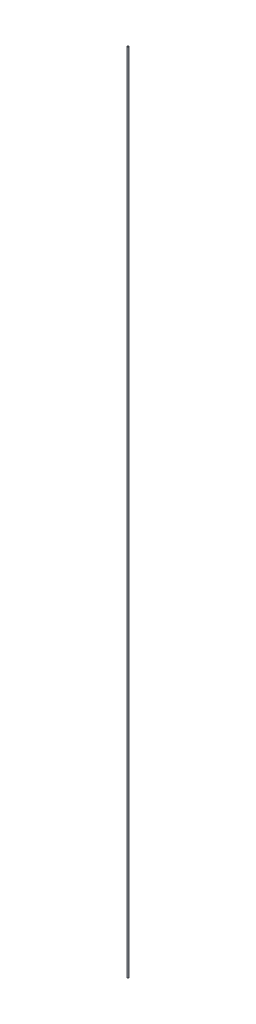
ISO-10303-21;
HEADER;
FILE_DESCRIPTION(('STEP AP214'),'2;1');
FILE_NAME('part.step','',(''),(''),'','','');
FILE_SCHEMA(('AUTOMOTIVE_DESIGN { 1 0 10303 214 1 1 1 1 }'));
ENDSEC;
DATA;
#1=APPLICATION_CONTEXT('core data for automotive mechanical design processes');
#2=APPLICATION_PROTOCOL_DEFINITION('international standard','automotive_design',2000,#1);
#3=PRODUCT_CONTEXT('',#1,'mechanical');
#4=PRODUCT('Part','Part','',(#3));
#5=PRODUCT_RELATED_PRODUCT_CATEGORY('part','',(#4));
#6=PRODUCT_DEFINITION_FORMATION('','',#4);
#7=PRODUCT_DEFINITION_CONTEXT('part definition',#1,'design');
#8=PRODUCT_DEFINITION('design','',#6,#7);
#9=PRODUCT_DEFINITION_SHAPE('','',#8);
#10=(LENGTH_UNIT() NAMED_UNIT(*) SI_UNIT(.MILLI.,.METRE.));
#11=(NAMED_UNIT(*) PLANE_ANGLE_UNIT() SI_UNIT($,.RADIAN.));
#12=(NAMED_UNIT(*) SI_UNIT($,.STERADIAN.) SOLID_ANGLE_UNIT());
#13=UNCERTAINTY_MEASURE_WITH_UNIT(LENGTH_MEASURE(1.E-05),#10,'distance_accuracy_value','');
#14=(GEOMETRIC_REPRESENTATION_CONTEXT(3) GLOBAL_UNCERTAINTY_ASSIGNED_CONTEXT((#13)) GLOBAL_UNIT_ASSIGNED_CONTEXT((#10,
#11,#12)) REPRESENTATION_CONTEXT('',''));
#15=CARTESIAN_POINT('',(0.,0.,0.));
#16=DIRECTION('',(0.,0.,1.));
#17=DIRECTION('',(1.,0.,0.));
#18=AXIS2_PLACEMENT_3D('',#15,#16,#17);
#19=CARTESIAN_POINT('',(0.,0.,0.));
#20=DIRECTION('',(0.,1.,0.));
#21=DIRECTION('',(0.,0.,1.));
#22=AXIS2_PLACEMENT_3D('',#19,#20,#21);
#23=PLANE('',#22);
#24=CARTESIAN_POINT('',(0.,0.,0.));
#25=DIRECTION('',(0.,1.,0.));
#26=DIRECTION('',(0.,0.,1.));
#27=AXIS2_PLACEMENT_3D('',#24,#25,#26);
#28=CIRCLE('',#27,6.35);
#29=CARTESIAN_POINT('',(0.,0.,6.35));
#30=VERTEX_POINT('',#29);
#31=EDGE_CURVE('E48',#30,#30,#28,.T.);
#32=ORIENTED_EDGE('',*,*,#31,.F.);
#33=EDGE_LOOP('',(#32));
#34=FACE_BOUND('',#33,.T.);
#35=ADVANCED_FACE('F42',(#34),#23,.F.);
#36=CARTESIAN_POINT('',(0.,7872.984,0.));
#37=DIRECTION('',(0.,1.,0.));
#38=DIRECTION('',(0.,0.,1.));
#39=AXIS2_PLACEMENT_3D('',#36,#37,#38);
#40=PLANE('',#39);
#41=CARTESIAN_POINT('',(0.,7872.984,0.));
#42=DIRECTION('',(0.,1.,0.));
#43=DIRECTION('',(0.,0.,1.));
#44=AXIS2_PLACEMENT_3D('',#41,#42,#43);
#45=CIRCLE('',#44,6.35);
#46=CARTESIAN_POINT('',(0.,7872.984,6.35));
#47=VERTEX_POINT('',#46);
#48=EDGE_CURVE('E11',#47,#47,#45,.T.);
#49=ORIENTED_EDGE('',*,*,#48,.T.);
#50=EDGE_LOOP('',(#49));
#51=FACE_BOUND('',#50,.T.);
#52=ADVANCED_FACE('F57',(#51),#40,.T.);
#53=CARTESIAN_POINT('',(0.,0.,0.));
#54=DIRECTION('',(0.,1.,0.));
#55=DIRECTION('',(0.,0.,1.));
#56=AXIS2_PLACEMENT_3D('',#53,#54,#55);
#57=CYLINDRICAL_SURFACE('',#56,6.35);
#58=ORIENTED_EDGE('',*,*,#48,.F.);
#59=EDGE_LOOP('',(#58));
#60=FACE_BOUND('',#59,.T.);
#61=ORIENTED_EDGE('',*,*,#31,.T.);
#62=EDGE_LOOP('',(#61));
#63=FACE_BOUND('',#62,.T.);
#64=ADVANCED_FACE('F54',(#60,#63),#57,.T.);
#65=CLOSED_SHELL('',(#35,#52,#64));
#66=MANIFOLD_SOLID_BREP('B2',#65);
#67=ADVANCED_BREP_SHAPE_REPRESENTATION('',(#18,#66),#14);
#68=SHAPE_DEFINITION_REPRESENTATION(#9,#67);
ENDSEC;
END-ISO-10303-21;
